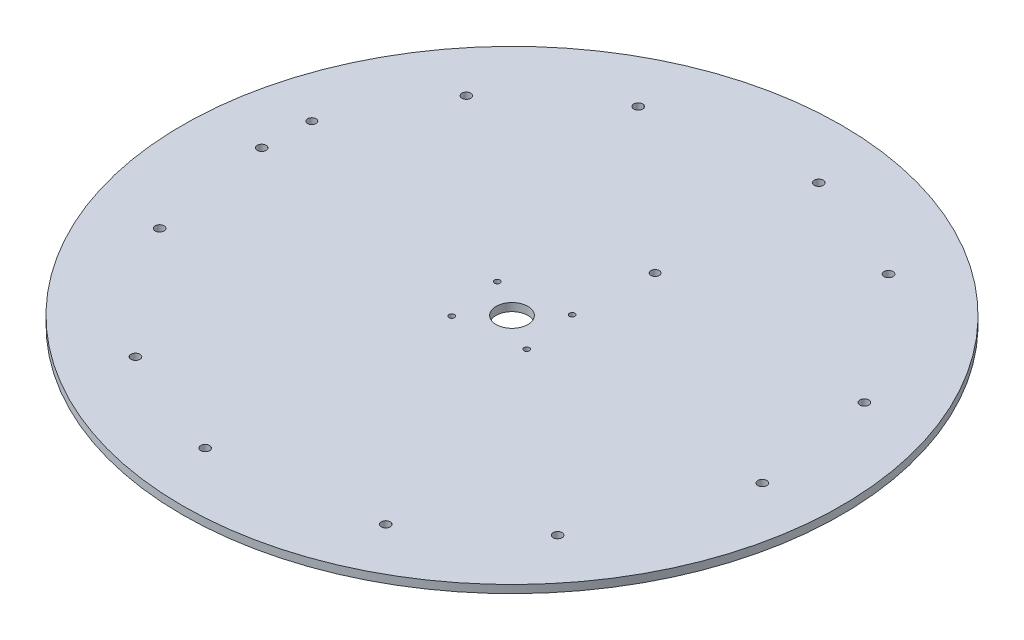
ISO-10303-21;
HEADER;
FILE_DESCRIPTION(('STEP AP214'),'2;1');
FILE_NAME('part.step','',(''),(''),'','','');
FILE_SCHEMA(('AUTOMOTIVE_DESIGN { 1 0 10303 214 1 1 1 1 }'));
ENDSEC;
DATA;
#1=APPLICATION_CONTEXT('core data for automotive mechanical design processes');
#2=APPLICATION_PROTOCOL_DEFINITION('international standard','automotive_design',2000,#1);
#3=PRODUCT_CONTEXT('',#1,'mechanical');
#4=PRODUCT('Part','Part','',(#3));
#5=PRODUCT_RELATED_PRODUCT_CATEGORY('part','',(#4));
#6=PRODUCT_DEFINITION_FORMATION('','',#4);
#7=PRODUCT_DEFINITION_CONTEXT('part definition',#1,'design');
#8=PRODUCT_DEFINITION('design','',#6,#7);
#9=PRODUCT_DEFINITION_SHAPE('','',#8);
#10=(LENGTH_UNIT() NAMED_UNIT(*) SI_UNIT(.MILLI.,.METRE.));
#11=(NAMED_UNIT(*) PLANE_ANGLE_UNIT() SI_UNIT($,.RADIAN.));
#12=(NAMED_UNIT(*) SI_UNIT($,.STERADIAN.) SOLID_ANGLE_UNIT());
#13=UNCERTAINTY_MEASURE_WITH_UNIT(LENGTH_MEASURE(1.E-05),#10,'distance_accuracy_value','');
#14=(GEOMETRIC_REPRESENTATION_CONTEXT(3) GLOBAL_UNCERTAINTY_ASSIGNED_CONTEXT((#13)) GLOBAL_UNIT_ASSIGNED_CONTEXT((#10,
#11,#12)) REPRESENTATION_CONTEXT('',''));
#15=CARTESIAN_POINT('',(0.,0.,0.));
#16=DIRECTION('',(0.,0.,1.));
#17=DIRECTION('',(1.,0.,0.));
#18=AXIS2_PLACEMENT_3D('',#15,#16,#17);
#19=CARTESIAN_POINT('',(0.,3.,0.));
#20=DIRECTION('',(0.,-1.,0.));
#21=DIRECTION('',(0.,0.,-1.));
#22=AXIS2_PLACEMENT_3D('',#19,#20,#21);
#23=CYLINDRICAL_SURFACE('',#22,125.);
#24=CARTESIAN_POINT('',(0.,3.,0.));
#25=DIRECTION('',(0.,1.,0.));
#26=DIRECTION('',(0.,0.,1.));
#27=AXIS2_PLACEMENT_3D('',#24,#25,#26);
#28=CIRCLE('',#27,125.);
#29=CARTESIAN_POINT('',(0.,3.,125.));
#30=VERTEX_POINT('',#29);
#31=EDGE_CURVE('E10',#30,#30,#28,.T.);
#32=ORIENTED_EDGE('',*,*,#31,.F.);
#33=EDGE_LOOP('',(#32));
#34=FACE_BOUND('',#33,.T.);
#35=CARTESIAN_POINT('',(0.,0.,0.));
#36=DIRECTION('',(0.,1.,0.));
#37=DIRECTION('',(0.,0.,1.));
#38=AXIS2_PLACEMENT_3D('',#35,#36,#37);
#39=CIRCLE('',#38,125.);
#40=CARTESIAN_POINT('',(0.,0.,125.));
#41=VERTEX_POINT('',#40);
#42=EDGE_CURVE('E43',#41,#41,#39,.T.);
#43=ORIENTED_EDGE('',*,*,#42,.T.);
#44=EDGE_LOOP('',(#43));
#45=FACE_BOUND('',#44,.T.);
#46=ADVANCED_FACE('F36',(#34,#45),#23,.T.);
#47=CARTESIAN_POINT('',(0.,3.,0.));
#48=DIRECTION('',(0.,1.,0.));
#49=DIRECTION('',(0.,0.,1.));
#50=AXIS2_PLACEMENT_3D('',#47,#48,#49);
#51=PLANE('',#50);
#52=CARTESIAN_POINT('',(-57.8243619755745,3.,84.9944281324211));
#53=DIRECTION('',(0.,1.,0.));
#54=DIRECTION('',(0.,0.,1.));
#55=AXIS2_PLACEMENT_3D('',#52,#53,#54);
#56=CIRCLE('',#55,1.7);
#57=CARTESIAN_POINT('',(-57.8243619755745,3.,86.6944281324211));
#58=VERTEX_POINT('',#57);
#59=EDGE_CURVE('E110',#58,#58,#56,.F.);
#60=ORIENTED_EDGE('',*,*,#59,.T.);
#61=EDGE_LOOP('',(#60));
#62=FACE_BOUND('',#61,.T.);
#63=CARTESIAN_POINT('',(95.4266926180047,3.,-38.2289940677021));
#64=DIRECTION('',(0.,1.,0.));
#65=DIRECTION('',(0.,0.,1.));
#66=AXIS2_PLACEMENT_3D('',#63,#64,#65);
#67=CIRCLE('',#66,1.7);
#68=CARTESIAN_POINT('',(95.4266926180047,3.,-36.5289940677021));
#69=VERTEX_POINT('',#68);
#70=EDGE_CURVE('E98',#69,#69,#67,.F.);
#71=ORIENTED_EDGE('',*,*,#70,.T.);
#72=EDGE_LOOP('',(#71));
#73=FACE_BOUND('',#72,.T.);
#74=CARTESIAN_POINT('',(102.519514930595,3.,7.58015236226344));
#75=DIRECTION('',(0.,1.,0.));
#76=DIRECTION('',(0.,0.,1.));
#77=AXIS2_PLACEMENT_3D('',#74,#75,#76);
#78=CIRCLE('',#77,1.7);
#79=CARTESIAN_POINT('',(102.519514930595,3.,9.28015236226344));
#80=VERTEX_POINT('',#79);
#81=EDGE_CURVE('E95',#80,#80,#78,.F.);
#82=ORIENTED_EDGE('',*,*,#81,.T.);
#83=EDGE_LOOP('',(#82));
#84=FACE_BOUND('',#83,.T.);
#85=CARTESIAN_POINT('',(-80.8206263327573,3.,-63.5274429724696));
#86=DIRECTION('',(0.,1.,0.));
#87=DIRECTION('',(0.,0.,1.));
#88=AXIS2_PLACEMENT_3D('',#85,#86,#87);
#89=CIRCLE('',#88,1.7);
#90=CARTESIAN_POINT('',(-80.8206263327573,3.,-61.8274429724696));
#91=VERTEX_POINT('',#90);
#92=EDGE_CURVE('E92',#91,#91,#89,.F.);
#93=ORIENTED_EDGE('',*,*,#92,.T.);
#94=EDGE_LOOP('',(#93));
#95=FACE_BOUND('',#94,.T.);
#96=CARTESIAN_POINT('',(-14.6060662852482,3.,101.756437040172));
#97=DIRECTION('',(0.,1.,0.));
#98=DIRECTION('',(0.,0.,1.));
#99=AXIS2_PLACEMENT_3D('',#96,#97,#98);
#100=CIRCLE('',#99,1.7);
#101=CARTESIAN_POINT('',(-14.6060662852482,3.,103.456437040172));
#102=VERTEX_POINT('',#101);
#103=EDGE_CURVE('E88',#102,#102,#100,.F.);
#104=ORIENTED_EDGE('',*,*,#103,.T.);
#105=EDGE_LOOP('',(#104));
#106=FACE_BOUND('',#105,.T.);
#107=CARTESIAN_POINT('',(-44.6951529550211,3.,-92.5745804946846));
#108=DIRECTION('',(0.,1.,0.));
#109=DIRECTION('',(0.,0.,1.));
#110=AXIS2_PLACEMENT_3D('',#107,#108,#109);
#111=CIRCLE('',#110,1.7);
#112=CARTESIAN_POINT('',(-44.6951529550211,3.,-90.8745804946846));
#113=VERTEX_POINT('',#112);
#114=EDGE_CURVE('E84',#113,#113,#111,.F.);
#115=ORIENTED_EDGE('',*,*,#114,.T.);
#116=EDGE_LOOP('',(#115));
#117=FACE_BOUND('',#116,.T.);
#118=CARTESIAN_POINT('',(11.1984146036627,3.,-11.6251485565594));
#119=DIRECTION('',(0.,1.,0.));
#120=DIRECTION('',(0.,0.,1.));
#121=AXIS2_PLACEMENT_3D('',#118,#119,#120);
#122=CIRCLE('',#121,1.05);
#123=CARTESIAN_POINT('',(11.1984146036627,3.,-10.5751485565594));
#124=VERTEX_POINT('',#123);
#125=EDGE_CURVE('E114',#124,#124,#122,.T.);
#126=ORIENTED_EDGE('',*,*,#125,.F.);
#127=EDGE_LOOP('',(#126));
#128=FACE_BOUND('',#127,.T.);
#129=CARTESIAN_POINT('',(13.8891587950704,3.,8.30091436381541));
#130=DIRECTION('',(0.,1.,0.));
#131=DIRECTION('',(0.,0.,1.));
#132=AXIS2_PLACEMENT_3D('',#129,#130,#131);
#133=CIRCLE('',#132,1.05);
#134=CARTESIAN_POINT('',(13.8891587950704,3.,9.35091436381541));
#135=VERTEX_POINT('',#134);
#136=EDGE_CURVE('E122',#135,#135,#133,.T.);
#137=ORIENTED_EDGE('',*,*,#136,.F.);
#138=EDGE_LOOP('',(#137));
#139=FACE_BOUND('',#138,.T.);
#140=CARTESIAN_POINT('',(-11.1984146036629,3.,11.6251485565594));
#141=DIRECTION('',(0.,1.,0.));
#142=DIRECTION('',(0.,0.,1.));
#143=AXIS2_PLACEMENT_3D('',#140,#141,#142);
#144=CIRCLE('',#143,1.05);
#145=CARTESIAN_POINT('',(-11.1984146036629,3.,12.6751485565594));
#146=VERTEX_POINT('',#145);
#147=EDGE_CURVE('E128',#146,#146,#144,.T.);
#148=ORIENTED_EDGE('',*,*,#147,.F.);
#149=EDGE_LOOP('',(#148));
#150=FACE_BOUND('',#149,.T.);
#151=CARTESIAN_POINT('',(-13.8891587950706,3.,-8.30091436381542));
#152=DIRECTION('',(0.,1.,0.));
#153=DIRECTION('',(0.,0.,1.));
#154=AXIS2_PLACEMENT_3D('',#151,#152,#153);
#155=CIRCLE('',#154,1.05);
#156=CARTESIAN_POINT('',(-13.8891587950706,3.,-7.25091436381541));
#157=VERTEX_POINT('',#156);
#158=EDGE_CURVE('E113',#157,#157,#155,.T.);
#159=ORIENTED_EDGE('',*,*,#158,.F.);
#160=EDGE_LOOP('',(#159));
#161=FACE_BOUND('',#160,.T.);
#162=CARTESIAN_POINT('',(-101.77809989739,3.,-25.8547554866955));
#163=DIRECTION('',(0.,-1.,0.));
#164=DIRECTION('',(0.,0.,-1.));
#165=AXIS2_PLACEMENT_3D('',#162,#163,#164);
#166=CIRCLE('',#165,1.6);
#167=CARTESIAN_POINT('',(-101.77809989739,3.,-27.4547554866955));
#168=VERTEX_POINT('',#167);
#169=EDGE_CURVE('E80',#168,#168,#166,.T.);
#170=ORIENTED_EDGE('',*,*,#169,.T.);
#171=EDGE_LOOP('',(#170));
#172=FACE_BOUND('',#171,.T.);
#173=CARTESIAN_POINT('',(13.2167740431928,3.,-41.0921754582449));
#174=DIRECTION('',(0.,-1.,0.));
#175=DIRECTION('',(0.,0.,-1.));
#176=AXIS2_PLACEMENT_3D('',#173,#174,#175);
#177=CIRCLE('',#176,1.6);
#178=CARTESIAN_POINT('',(13.2167740431928,3.,-42.6921754582449));
#179=VERTEX_POINT('',#178);
#180=EDGE_CURVE('E143',#179,#179,#177,.T.);
#181=ORIENTED_EDGE('',*,*,#180,.T.);
#182=EDGE_LOOP('',(#181));
#183=FACE_BOUND('',#182,.T.);
#184=CARTESIAN_POINT('',(0.,3.,0.));
#185=DIRECTION('',(0.,1.,0.));
#186=DIRECTION('',(0.,0.,1.));
#187=AXIS2_PLACEMENT_3D('',#184,#185,#186);
#188=CIRCLE('',#187,6.);
#189=CARTESIAN_POINT('',(0.,3.,6.));
#190=VERTEX_POINT('',#189);
#191=EDGE_CURVE('E57',#190,#190,#188,.F.);
#192=ORIENTED_EDGE('',*,*,#191,.T.);
#193=EDGE_LOOP('',(#192));
#194=FACE_BOUND('',#193,.T.);
#195=CARTESIAN_POINT('',(-102.519514930595,3.,-7.58015236226416));
#196=DIRECTION('',(0.,1.,0.));
#197=DIRECTION('',(0.,0.,1.));
#198=AXIS2_PLACEMENT_3D('',#195,#196,#197);
#199=CIRCLE('',#198,1.7);
#200=CARTESIAN_POINT('',(-102.519514930595,3.,-5.88015236226416));
#201=VERTEX_POINT('',#200);
#202=EDGE_CURVE('E48',#201,#201,#199,.F.);
#203=ORIENTED_EDGE('',*,*,#202,.T.);
#204=EDGE_LOOP('',(#203));
#205=FACE_BOUND('',#204,.T.);
#206=CARTESIAN_POINT('',(80.8206263327569,3.,63.5274429724702));
#207=DIRECTION('',(0.,1.,0.));
#208=DIRECTION('',(0.,0.,1.));
#209=AXIS2_PLACEMENT_3D('',#206,#207,#208);
#210=CIRCLE('',#209,1.7);
#211=CARTESIAN_POINT('',(80.8206263327569,3.,65.2274429724702));
#212=VERTEX_POINT('',#211);
#213=EDGE_CURVE('E73',#212,#212,#210,.F.);
#214=ORIENTED_EDGE('',*,*,#213,.T.);
#215=EDGE_LOOP('',(#214));
#216=FACE_BOUND('',#215,.T.);
#217=CARTESIAN_POINT('',(44.6951529550204,3.,92.5745804946849));
#218=DIRECTION('',(0.,1.,0.));
#219=DIRECTION('',(0.,0.,1.));
#220=AXIS2_PLACEMENT_3D('',#217,#218,#219);
#221=CIRCLE('',#220,1.7);
#222=CARTESIAN_POINT('',(44.6951529550204,3.,94.2745804946849));
#223=VERTEX_POINT('',#222);
#224=EDGE_CURVE('E69',#223,#223,#221,.F.);
#225=ORIENTED_EDGE('',*,*,#224,.T.);
#226=EDGE_LOOP('',(#225));
#227=FACE_BOUND('',#226,.T.);
#228=CARTESIAN_POINT('',(14.6060662852475,3.,-101.756437040172));
#229=DIRECTION('',(0.,1.,0.));
#230=DIRECTION('',(0.,0.,1.));
#231=AXIS2_PLACEMENT_3D('',#228,#229,#230);
#232=CIRCLE('',#231,1.7);
#233=CARTESIAN_POINT('',(14.6060662852475,3.,-100.056437040172));
#234=VERTEX_POINT('',#233);
#235=EDGE_CURVE('E65',#234,#234,#232,.F.);
#236=ORIENTED_EDGE('',*,*,#235,.T.);
#237=EDGE_LOOP('',(#236));
#238=FACE_BOUND('',#237,.T.);
#239=CARTESIAN_POINT('',(-95.426692618005,3.,38.2289940677014));
#240=DIRECTION('',(0.,1.,0.));
#241=DIRECTION('',(0.,0.,1.));
#242=AXIS2_PLACEMENT_3D('',#239,#240,#241);
#243=CIRCLE('',#242,1.7);
#244=CARTESIAN_POINT('',(-95.426692618005,3.,39.9289940677014));
#245=VERTEX_POINT('',#244);
#246=EDGE_CURVE('E61',#245,#245,#243,.F.);
#247=ORIENTED_EDGE('',*,*,#246,.T.);
#248=EDGE_LOOP('',(#247));
#249=FACE_BOUND('',#248,.T.);
#250=CARTESIAN_POINT('',(57.8243619755739,3.,-84.9944281324215));
#251=DIRECTION('',(0.,1.,0.));
#252=DIRECTION('',(0.,0.,1.));
#253=AXIS2_PLACEMENT_3D('',#250,#251,#252);
#254=CIRCLE('',#253,1.7);
#255=CARTESIAN_POINT('',(57.8243619755739,3.,-83.2944281324215));
#256=VERTEX_POINT('',#255);
#257=EDGE_CURVE('E56',#256,#256,#254,.F.);
#258=ORIENTED_EDGE('',*,*,#257,.T.);
#259=EDGE_LOOP('',(#258));
#260=FACE_BOUND('',#259,.T.);
#261=ORIENTED_EDGE('',*,*,#31,.T.);
#262=EDGE_LOOP('',(#261));
#263=FACE_BOUND('',#262,.T.);
#264=ADVANCED_FACE('F160',(#62,#73,#84,#95,#106,#117,#128,#139,#150,#161,#172,#183,#194,#205,
#216,#227,#238,#249,#260,#263),#51,.T.);
#265=CARTESIAN_POINT('',(0.,0.,0.));
#266=DIRECTION('',(0.,1.,0.));
#267=DIRECTION('',(0.,0.,1.));
#268=AXIS2_PLACEMENT_3D('',#265,#266,#267);
#269=PLANE('',#268);
#270=CARTESIAN_POINT('',(-57.8243619755745,0.,84.9944281324211));
#271=DIRECTION('',(0.,1.,0.));
#272=DIRECTION('',(0.,0.,1.));
#273=AXIS2_PLACEMENT_3D('',#270,#271,#272);
#274=CIRCLE('',#273,1.7);
#275=CARTESIAN_POINT('',(-57.8243619755745,0.,86.6944281324211));
#276=VERTEX_POINT('',#275);
#277=EDGE_CURVE('E39',#276,#276,#274,.F.);
#278=ORIENTED_EDGE('',*,*,#277,.F.);
#279=EDGE_LOOP('',(#278));
#280=FACE_BOUND('',#279,.T.);
#281=CARTESIAN_POINT('',(95.4266926180047,0.,-38.2289940677021));
#282=DIRECTION('',(0.,1.,0.));
#283=DIRECTION('',(0.,0.,1.));
#284=AXIS2_PLACEMENT_3D('',#281,#282,#283);
#285=CIRCLE('',#284,1.7);
#286=CARTESIAN_POINT('',(95.4266926180047,0.,-36.5289940677021));
#287=VERTEX_POINT('',#286);
#288=EDGE_CURVE('E96',#287,#287,#285,.F.);
#289=ORIENTED_EDGE('',*,*,#288,.F.);
#290=EDGE_LOOP('',(#289));
#291=FACE_BOUND('',#290,.T.);
#292=CARTESIAN_POINT('',(102.519514930595,0.,7.58015236226344));
#293=DIRECTION('',(0.,1.,0.));
#294=DIRECTION('',(0.,0.,1.));
#295=AXIS2_PLACEMENT_3D('',#292,#293,#294);
#296=CIRCLE('',#295,1.7);
#297=CARTESIAN_POINT('',(102.519514930595,0.,9.28015236226344));
#298=VERTEX_POINT('',#297);
#299=EDGE_CURVE('E93',#298,#298,#296,.F.);
#300=ORIENTED_EDGE('',*,*,#299,.F.);
#301=EDGE_LOOP('',(#300));
#302=FACE_BOUND('',#301,.T.);
#303=CARTESIAN_POINT('',(-80.8206263327573,0.,-63.5274429724696));
#304=DIRECTION('',(0.,1.,0.));
#305=DIRECTION('',(0.,0.,1.));
#306=AXIS2_PLACEMENT_3D('',#303,#304,#305);
#307=CIRCLE('',#306,1.7);
#308=CARTESIAN_POINT('',(-80.8206263327573,0.,-61.8274429724696));
#309=VERTEX_POINT('',#308);
#310=EDGE_CURVE('E89',#309,#309,#307,.F.);
#311=ORIENTED_EDGE('',*,*,#310,.F.);
#312=EDGE_LOOP('',(#311));
#313=FACE_BOUND('',#312,.T.);
#314=CARTESIAN_POINT('',(-14.6060662852482,0.,101.756437040172));
#315=DIRECTION('',(0.,1.,0.));
#316=DIRECTION('',(0.,0.,1.));
#317=AXIS2_PLACEMENT_3D('',#314,#315,#316);
#318=CIRCLE('',#317,1.7);
#319=CARTESIAN_POINT('',(-14.6060662852482,0.,103.456437040172));
#320=VERTEX_POINT('',#319);
#321=EDGE_CURVE('E85',#320,#320,#318,.F.);
#322=ORIENTED_EDGE('',*,*,#321,.F.);
#323=EDGE_LOOP('',(#322));
#324=FACE_BOUND('',#323,.T.);
#325=CARTESIAN_POINT('',(-44.6951529550211,0.,-92.5745804946846));
#326=DIRECTION('',(0.,1.,0.));
#327=DIRECTION('',(0.,0.,1.));
#328=AXIS2_PLACEMENT_3D('',#325,#326,#327);
#329=CIRCLE('',#328,1.7);
#330=CARTESIAN_POINT('',(-44.6951529550211,0.,-90.8745804946846));
#331=VERTEX_POINT('',#330);
#332=EDGE_CURVE('E81',#331,#331,#329,.F.);
#333=ORIENTED_EDGE('',*,*,#332,.F.);
#334=EDGE_LOOP('',(#333));
#335=FACE_BOUND('',#334,.T.);
#336=CARTESIAN_POINT('',(11.1984146036627,0.,-11.6251485565594));
#337=DIRECTION('',(0.,1.,0.));
#338=DIRECTION('',(0.,0.,1.));
#339=AXIS2_PLACEMENT_3D('',#336,#337,#338);
#340=CIRCLE('',#339,1.05);
#341=CARTESIAN_POINT('',(11.1984146036627,0.,-10.5751485565594));
#342=VERTEX_POINT('',#341);
#343=EDGE_CURVE('E117',#342,#342,#340,.F.);
#344=ORIENTED_EDGE('',*,*,#343,.F.);
#345=EDGE_LOOP('',(#344));
#346=FACE_BOUND('',#345,.T.);
#347=CARTESIAN_POINT('',(13.8891587950704,0.,8.30091436381541));
#348=DIRECTION('',(0.,1.,0.));
#349=DIRECTION('',(0.,0.,1.));
#350=AXIS2_PLACEMENT_3D('',#347,#348,#349);
#351=CIRCLE('',#350,1.05);
#352=CARTESIAN_POINT('',(13.8891587950704,0.,9.35091436381541));
#353=VERTEX_POINT('',#352);
#354=EDGE_CURVE('E118',#353,#353,#351,.F.);
#355=ORIENTED_EDGE('',*,*,#354,.F.);
#356=EDGE_LOOP('',(#355));
#357=FACE_BOUND('',#356,.T.);
#358=CARTESIAN_POINT('',(-11.1984146036629,0.,11.6251485565594));
#359=DIRECTION('',(0.,1.,0.));
#360=DIRECTION('',(0.,0.,1.));
#361=AXIS2_PLACEMENT_3D('',#358,#359,#360);
#362=CIRCLE('',#361,1.05);
#363=CARTESIAN_POINT('',(-11.1984146036629,0.,12.6751485565594));
#364=VERTEX_POINT('',#363);
#365=EDGE_CURVE('E125',#364,#364,#362,.F.);
#366=ORIENTED_EDGE('',*,*,#365,.F.);
#367=EDGE_LOOP('',(#366));
#368=FACE_BOUND('',#367,.T.);
#369=CARTESIAN_POINT('',(-13.8891587950706,0.,-8.30091436381542));
#370=DIRECTION('',(0.,1.,0.));
#371=DIRECTION('',(0.,0.,1.));
#372=AXIS2_PLACEMENT_3D('',#369,#370,#371);
#373=CIRCLE('',#372,1.05);
#374=CARTESIAN_POINT('',(-13.8891587950706,0.,-7.25091436381541));
#375=VERTEX_POINT('',#374);
#376=EDGE_CURVE('E131',#375,#375,#373,.F.);
#377=ORIENTED_EDGE('',*,*,#376,.F.);
#378=EDGE_LOOP('',(#377));
#379=FACE_BOUND('',#378,.T.);
#380=CARTESIAN_POINT('',(-101.77809989739,0.,-25.8547554866955));
#381=DIRECTION('',(0.,-1.,0.));
#382=DIRECTION('',(0.,0.,-1.));
#383=AXIS2_PLACEMENT_3D('',#380,#381,#382);
#384=CIRCLE('',#383,1.6);
#385=CARTESIAN_POINT('',(-101.77809989739,0.,-27.4547554866955));
#386=VERTEX_POINT('',#385);
#387=EDGE_CURVE('E140',#386,#386,#384,.T.);
#388=ORIENTED_EDGE('',*,*,#387,.F.);
#389=EDGE_LOOP('',(#388));
#390=FACE_BOUND('',#389,.T.);
#391=CARTESIAN_POINT('',(13.2167740431928,0.,-41.0921754582449));
#392=DIRECTION('',(0.,-1.,0.));
#393=DIRECTION('',(0.,0.,-1.));
#394=AXIS2_PLACEMENT_3D('',#391,#392,#393);
#395=CIRCLE('',#394,1.6);
#396=CARTESIAN_POINT('',(13.2167740431928,0.,-42.6921754582449));
#397=VERTEX_POINT('',#396);
#398=EDGE_CURVE('E121',#397,#397,#395,.T.);
#399=ORIENTED_EDGE('',*,*,#398,.F.);
#400=EDGE_LOOP('',(#399));
#401=FACE_BOUND('',#400,.T.);
#402=CARTESIAN_POINT('',(0.,0.,0.));
#403=DIRECTION('',(0.,1.,0.));
#404=DIRECTION('',(0.,0.,1.));
#405=AXIS2_PLACEMENT_3D('',#402,#403,#404);
#406=CIRCLE('',#405,6.);
#407=CARTESIAN_POINT('',(0.,0.,6.));
#408=VERTEX_POINT('',#407);
#409=EDGE_CURVE('E77',#408,#408,#406,.F.);
#410=ORIENTED_EDGE('',*,*,#409,.F.);
#411=EDGE_LOOP('',(#410));
#412=FACE_BOUND('',#411,.T.);
#413=CARTESIAN_POINT('',(-102.519514930595,0.,-7.58015236226416));
#414=DIRECTION('',(0.,1.,0.));
#415=DIRECTION('',(0.,0.,1.));
#416=AXIS2_PLACEMENT_3D('',#413,#414,#415);
#417=CIRCLE('',#416,1.7);
#418=CARTESIAN_POINT('',(-102.519514930595,0.,-5.88015236226416));
#419=VERTEX_POINT('',#418);
#420=EDGE_CURVE('E74',#419,#419,#417,.F.);
#421=ORIENTED_EDGE('',*,*,#420,.F.);
#422=EDGE_LOOP('',(#421));
#423=FACE_BOUND('',#422,.T.);
#424=CARTESIAN_POINT('',(80.8206263327569,0.,63.5274429724702));
#425=DIRECTION('',(0.,1.,0.));
#426=DIRECTION('',(0.,0.,1.));
#427=AXIS2_PLACEMENT_3D('',#424,#425,#426);
#428=CIRCLE('',#427,1.7);
#429=CARTESIAN_POINT('',(80.8206263327569,0.,65.2274429724702));
#430=VERTEX_POINT('',#429);
#431=EDGE_CURVE('E70',#430,#430,#428,.F.);
#432=ORIENTED_EDGE('',*,*,#431,.F.);
#433=EDGE_LOOP('',(#432));
#434=FACE_BOUND('',#433,.T.);
#435=CARTESIAN_POINT('',(44.6951529550204,0.,92.5745804946849));
#436=DIRECTION('',(0.,1.,0.));
#437=DIRECTION('',(0.,0.,1.));
#438=AXIS2_PLACEMENT_3D('',#435,#436,#437);
#439=CIRCLE('',#438,1.7);
#440=CARTESIAN_POINT('',(44.6951529550204,0.,94.2745804946849));
#441=VERTEX_POINT('',#440);
#442=EDGE_CURVE('E66',#441,#441,#439,.F.);
#443=ORIENTED_EDGE('',*,*,#442,.F.);
#444=EDGE_LOOP('',(#443));
#445=FACE_BOUND('',#444,.T.);
#446=CARTESIAN_POINT('',(14.6060662852475,0.,-101.756437040172));
#447=DIRECTION('',(0.,1.,0.));
#448=DIRECTION('',(0.,0.,1.));
#449=AXIS2_PLACEMENT_3D('',#446,#447,#448);
#450=CIRCLE('',#449,1.7);
#451=CARTESIAN_POINT('',(14.6060662852475,0.,-100.056437040172));
#452=VERTEX_POINT('',#451);
#453=EDGE_CURVE('E62',#452,#452,#450,.F.);
#454=ORIENTED_EDGE('',*,*,#453,.F.);
#455=EDGE_LOOP('',(#454));
#456=FACE_BOUND('',#455,.T.);
#457=CARTESIAN_POINT('',(-95.426692618005,0.,38.2289940677014));
#458=DIRECTION('',(0.,1.,0.));
#459=DIRECTION('',(0.,0.,1.));
#460=AXIS2_PLACEMENT_3D('',#457,#458,#459);
#461=CIRCLE('',#460,1.7);
#462=CARTESIAN_POINT('',(-95.426692618005,0.,39.9289940677014));
#463=VERTEX_POINT('',#462);
#464=EDGE_CURVE('E58',#463,#463,#461,.F.);
#465=ORIENTED_EDGE('',*,*,#464,.F.);
#466=EDGE_LOOP('',(#465));
#467=FACE_BOUND('',#466,.T.);
#468=CARTESIAN_POINT('',(57.8243619755739,0.,-84.9944281324215));
#469=DIRECTION('',(0.,1.,0.));
#470=DIRECTION('',(0.,0.,1.));
#471=AXIS2_PLACEMENT_3D('',#468,#469,#470);
#472=CIRCLE('',#471,1.7);
#473=CARTESIAN_POINT('',(57.8243619755739,0.,-83.2944281324215));
#474=VERTEX_POINT('',#473);
#475=EDGE_CURVE('E53',#474,#474,#472,.F.);
#476=ORIENTED_EDGE('',*,*,#475,.F.);
#477=EDGE_LOOP('',(#476));
#478=FACE_BOUND('',#477,.T.);
#479=ORIENTED_EDGE('',*,*,#42,.F.);
#480=EDGE_LOOP('',(#479));
#481=FACE_BOUND('',#480,.T.);
#482=ADVANCED_FACE('F171',(#280,#291,#302,#313,#324,#335,#346,#357,#368,#379,#390,#401,#412,
#423,#434,#445,#456,#467,#478,#481),#269,.F.);
#483=CARTESIAN_POINT('',(57.8243619755739,65.,-84.9944281324215));
#484=DIRECTION('',(0.,-1.,0.));
#485=DIRECTION('',(0.,0.,-1.));
#486=AXIS2_PLACEMENT_3D('',#483,#484,#485);
#487=CYLINDRICAL_SURFACE('',#486,1.7);
#488=ORIENTED_EDGE('',*,*,#257,.F.);
#489=EDGE_LOOP('',(#488));
#490=FACE_BOUND('',#489,.T.);
#491=ORIENTED_EDGE('',*,*,#475,.T.);
#492=EDGE_LOOP('',(#491));
#493=FACE_BOUND('',#492,.T.);
#494=ADVANCED_FACE('F174',(#490,#493),#487,.F.);
#495=CARTESIAN_POINT('',(-95.426692618005,65.,38.2289940677014));
#496=DIRECTION('',(0.,-1.,0.));
#497=DIRECTION('',(0.,0.,-1.));
#498=AXIS2_PLACEMENT_3D('',#495,#496,#497);
#499=CYLINDRICAL_SURFACE('',#498,1.7);
#500=ORIENTED_EDGE('',*,*,#246,.F.);
#501=EDGE_LOOP('',(#500));
#502=FACE_BOUND('',#501,.T.);
#503=ORIENTED_EDGE('',*,*,#464,.T.);
#504=EDGE_LOOP('',(#503));
#505=FACE_BOUND('',#504,.T.);
#506=ADVANCED_FACE('F199',(#502,#505),#499,.F.);
#507=CARTESIAN_POINT('',(14.6060662852475,65.,-101.756437040172));
#508=DIRECTION('',(0.,-1.,0.));
#509=DIRECTION('',(0.,0.,-1.));
#510=AXIS2_PLACEMENT_3D('',#507,#508,#509);
#511=CYLINDRICAL_SURFACE('',#510,1.7);
#512=ORIENTED_EDGE('',*,*,#235,.F.);
#513=EDGE_LOOP('',(#512));
#514=FACE_BOUND('',#513,.T.);
#515=ORIENTED_EDGE('',*,*,#453,.T.);
#516=EDGE_LOOP('',(#515));
#517=FACE_BOUND('',#516,.T.);
#518=ADVANCED_FACE('F203',(#514,#517),#511,.F.);
#519=CARTESIAN_POINT('',(44.6951529550204,65.,92.5745804946849));
#520=DIRECTION('',(0.,-1.,0.));
#521=DIRECTION('',(0.,0.,-1.));
#522=AXIS2_PLACEMENT_3D('',#519,#520,#521);
#523=CYLINDRICAL_SURFACE('',#522,1.7);
#524=ORIENTED_EDGE('',*,*,#224,.F.);
#525=EDGE_LOOP('',(#524));
#526=FACE_BOUND('',#525,.T.);
#527=ORIENTED_EDGE('',*,*,#442,.T.);
#528=EDGE_LOOP('',(#527));
#529=FACE_BOUND('',#528,.T.);
#530=ADVANCED_FACE('F167',(#526,#529),#523,.F.);
#531=CARTESIAN_POINT('',(80.8206263327569,65.,63.5274429724702));
#532=DIRECTION('',(0.,-1.,0.));
#533=DIRECTION('',(0.,0.,-1.));
#534=AXIS2_PLACEMENT_3D('',#531,#532,#533);
#535=CYLINDRICAL_SURFACE('',#534,1.7);
#536=ORIENTED_EDGE('',*,*,#213,.F.);
#537=EDGE_LOOP('',(#536));
#538=FACE_BOUND('',#537,.T.);
#539=ORIENTED_EDGE('',*,*,#431,.T.);
#540=EDGE_LOOP('',(#539));
#541=FACE_BOUND('',#540,.T.);
#542=ADVANCED_FACE('F163',(#538,#541),#535,.F.);
#543=CARTESIAN_POINT('',(-102.519514930595,65.,-7.58015236226416));
#544=DIRECTION('',(0.,-1.,0.));
#545=DIRECTION('',(0.,0.,-1.));
#546=AXIS2_PLACEMENT_3D('',#543,#544,#545);
#547=CYLINDRICAL_SURFACE('',#546,1.7);
#548=ORIENTED_EDGE('',*,*,#202,.F.);
#549=EDGE_LOOP('',(#548));
#550=FACE_BOUND('',#549,.T.);
#551=ORIENTED_EDGE('',*,*,#420,.T.);
#552=EDGE_LOOP('',(#551));
#553=FACE_BOUND('',#552,.T.);
#554=ADVANCED_FACE('F166',(#550,#553),#547,.F.);
#555=CARTESIAN_POINT('',(0.,58.,0.));
#556=DIRECTION('',(0.,-1.,0.));
#557=DIRECTION('',(0.,0.,-1.));
#558=AXIS2_PLACEMENT_3D('',#555,#556,#557);
#559=CYLINDRICAL_SURFACE('',#558,6.);
#560=ORIENTED_EDGE('',*,*,#191,.F.);
#561=EDGE_LOOP('',(#560));
#562=FACE_BOUND('',#561,.T.);
#563=ORIENTED_EDGE('',*,*,#409,.T.);
#564=EDGE_LOOP('',(#563));
#565=FACE_BOUND('',#564,.T.);
#566=ADVANCED_FACE('F209',(#562,#565),#559,.F.);
#567=CARTESIAN_POINT('',(13.2167740431928,3.,-41.0921754582449));
#568=DIRECTION('',(0.,-1.,0.));
#569=DIRECTION('',(0.,0.,-1.));
#570=AXIS2_PLACEMENT_3D('',#567,#568,#569);
#571=CYLINDRICAL_SURFACE('',#570,1.6);
#572=ORIENTED_EDGE('',*,*,#180,.F.);
#573=EDGE_LOOP('',(#572));
#574=FACE_BOUND('',#573,.T.);
#575=ORIENTED_EDGE('',*,*,#398,.T.);
#576=EDGE_LOOP('',(#575));
#577=FACE_BOUND('',#576,.T.);
#578=ADVANCED_FACE('F217',(#574,#577),#571,.F.);
#579=CARTESIAN_POINT('',(-101.77809989739,3.,-25.8547554866955));
#580=DIRECTION('',(0.,-1.,0.));
#581=DIRECTION('',(0.,0.,-1.));
#582=AXIS2_PLACEMENT_3D('',#579,#580,#581);
#583=CYLINDRICAL_SURFACE('',#582,1.6);
#584=ORIENTED_EDGE('',*,*,#169,.F.);
#585=EDGE_LOOP('',(#584));
#586=FACE_BOUND('',#585,.T.);
#587=ORIENTED_EDGE('',*,*,#387,.T.);
#588=EDGE_LOOP('',(#587));
#589=FACE_BOUND('',#588,.T.);
#590=ADVANCED_FACE('F221',(#586,#589),#583,.F.);
#591=CARTESIAN_POINT('',(-13.8891587950706,-0.00100000000000013,-8.30091436381542));
#592=DIRECTION('',(0.,1.,0.));
#593=DIRECTION('',(0.,0.,1.));
#594=AXIS2_PLACEMENT_3D('',#591,#592,#593);
#595=CYLINDRICAL_SURFACE('',#594,1.05);
#596=CARTESIAN_POINT('',(-13.8891587950706,3.,-7.25091436381541));
#597=CARTESIAN_POINT('',(-13.8891587950706,2.96875,-7.25091436381541));
#598=CARTESIAN_POINT('',(-13.8891587950706,2.9375,-7.25091436381541));
#599=CARTESIAN_POINT('',(-13.8891587950706,2.875,-7.25091436381541));
#600=CARTESIAN_POINT('',(-13.8891587950706,2.84375,-7.25091436381541));
#601=CARTESIAN_POINT('',(-13.8891587950706,2.78125,-7.25091436381541));
#602=CARTESIAN_POINT('',(-13.8891587950706,2.75,-7.25091436381541));
#603=CARTESIAN_POINT('',(-13.8891587950706,2.6875,-7.25091436381541));
#604=CARTESIAN_POINT('',(-13.8891587950706,2.65625,-7.25091436381541));
#605=CARTESIAN_POINT('',(-13.8891587950706,2.59375,-7.25091436381541));
#606=CARTESIAN_POINT('',(-13.8891587950706,2.5625,-7.25091436381541));
#607=CARTESIAN_POINT('',(-13.8891587950706,2.5,-7.25091436381541));
#608=CARTESIAN_POINT('',(-13.8891587950706,2.46875,-7.25091436381541));
#609=CARTESIAN_POINT('',(-13.8891587950706,2.40625,-7.25091436381541));
#610=CARTESIAN_POINT('',(-13.8891587950706,2.375,-7.25091436381541));
#611=CARTESIAN_POINT('',(-13.8891587950706,2.3125,-7.25091436381541));
#612=CARTESIAN_POINT('',(-13.8891587950706,2.28125,-7.25091436381541));
#613=CARTESIAN_POINT('',(-13.8891587950706,2.21875,-7.25091436381541));
#614=CARTESIAN_POINT('',(-13.8891587950706,2.1875,-7.25091436381541));
#615=CARTESIAN_POINT('',(-13.8891587950706,2.125,-7.25091436381541));
#616=CARTESIAN_POINT('',(-13.8891587950706,2.09375,-7.25091436381541));
#617=CARTESIAN_POINT('',(-13.8891587950706,2.03125,-7.25091436381541));
#618=CARTESIAN_POINT('',(-13.8891587950706,2.,-7.25091436381541));
#619=CARTESIAN_POINT('',(-13.8891587950706,1.9375,-7.25091436381541));
#620=CARTESIAN_POINT('',(-13.8891587950706,1.90625,-7.25091436381541));
#621=CARTESIAN_POINT('',(-13.8891587950706,1.84375,-7.25091436381541));
#622=CARTESIAN_POINT('',(-13.8891587950706,1.8125,-7.25091436381541));
#623=CARTESIAN_POINT('',(-13.8891587950706,1.75,-7.25091436381541));
#624=CARTESIAN_POINT('',(-13.8891587950706,1.71875,-7.25091436381541));
#625=CARTESIAN_POINT('',(-13.8891587950706,1.65625,-7.25091436381541));
#626=CARTESIAN_POINT('',(-13.8891587950706,1.625,-7.25091436381541));
#627=CARTESIAN_POINT('',(-13.8891587950706,1.5625,-7.25091436381541));
#628=CARTESIAN_POINT('',(-13.8891587950706,1.53125,-7.25091436381541));
#629=CARTESIAN_POINT('',(-13.8891587950706,1.46875,-7.25091436381541));
#630=CARTESIAN_POINT('',(-13.8891587950706,1.4375,-7.25091436381541));
#631=CARTESIAN_POINT('',(-13.8891587950706,1.375,-7.25091436381541));
#632=CARTESIAN_POINT('',(-13.8891587950706,1.34375,-7.25091436381541));
#633=CARTESIAN_POINT('',(-13.8891587950706,1.28125,-7.25091436381541));
#634=CARTESIAN_POINT('',(-13.8891587950706,1.25,-7.25091436381541));
#635=CARTESIAN_POINT('',(-13.8891587950706,1.1875,-7.25091436381541));
#636=CARTESIAN_POINT('',(-13.8891587950706,1.15625,-7.25091436381541));
#637=CARTESIAN_POINT('',(-13.8891587950706,1.09375,-7.25091436381541));
#638=CARTESIAN_POINT('',(-13.8891587950706,1.0625,-7.25091436381541));
#639=CARTESIAN_POINT('',(-13.8891587950706,1.,-7.25091436381541));
#640=CARTESIAN_POINT('',(-13.8891587950706,0.96875,-7.25091436381541));
#641=CARTESIAN_POINT('',(-13.8891587950706,0.90625,-7.25091436381541));
#642=CARTESIAN_POINT('',(-13.8891587950706,0.875,-7.25091436381541));
#643=CARTESIAN_POINT('',(-13.8891587950706,0.8125,-7.25091436381541));
#644=CARTESIAN_POINT('',(-13.8891587950706,0.78125,-7.25091436381541));
#645=CARTESIAN_POINT('',(-13.8891587950706,0.71875,-7.25091436381541));
#646=CARTESIAN_POINT('',(-13.8891587950706,0.6875,-7.25091436381541));
#647=CARTESIAN_POINT('',(-13.8891587950706,0.625,-7.25091436381541));
#648=CARTESIAN_POINT('',(-13.8891587950706,0.59375,-7.25091436381541));
#649=CARTESIAN_POINT('',(-13.8891587950706,0.53125,-7.25091436381541));
#650=CARTESIAN_POINT('',(-13.8891587950706,0.5,-7.25091436381541));
#651=CARTESIAN_POINT('',(-13.8891587950706,0.4375,-7.25091436381541));
#652=CARTESIAN_POINT('',(-13.8891587950706,0.40625,-7.25091436381541));
#653=CARTESIAN_POINT('',(-13.8891587950706,0.34375,-7.25091436381541));
#654=CARTESIAN_POINT('',(-13.8891587950706,0.3125,-7.25091436381541));
#655=CARTESIAN_POINT('',(-13.8891587950706,0.25,-7.25091436381541));
#656=CARTESIAN_POINT('',(-13.8891587950706,0.21875,-7.25091436381541));
#657=CARTESIAN_POINT('',(-13.8891587950706,0.15625,-7.25091436381541));
#658=CARTESIAN_POINT('',(-13.8891587950706,0.125,-7.25091436381541));
#659=CARTESIAN_POINT('',(-13.8891587950706,0.0625000000000001,-7.25091436381541));
#660=CARTESIAN_POINT('',(-13.8891587950706,0.0312500000000001,-7.25091436381541));
#661=CARTESIAN_POINT('',(-13.8891587950706,0.,-7.25091436381541));
#662=B_SPLINE_CURVE_WITH_KNOTS('',3,(#596,#597,#598,#599,#600,#601,#602,#603,#604,#605,#606,
#607,#608,#609,#610,#611,#612,#613,#614,#615,#616,#617,#618,#619,#620,#621,#622,#623,#624,#625,
#626,#627,#628,#629,#630,#631,#632,#633,#634,#635,#636,#637,#638,#639,#640,#641,#642,#643,#644,
#645,#646,#647,#648,#649,#650,#651,#652,#653,#654,#655,#656,#657,#658,#659,#660,#661),
.UNSPECIFIED.,.F.,.F.,(4,2,2,2,2,2,2,2,2,2,2,2,2,2,2,2,2,2,2,2,2,2,2,2,2,2,2,2,2,2,2,2,4),(0.,
0.0937500000000001,0.1875,0.28125,0.375,0.46875,0.5625,0.65625,0.75,0.84375,0.9375,1.03125,
1.125,1.21875,1.3125,1.40625,1.5,1.59375,1.6875,1.78125,1.875,1.96875,2.0625,2.15625,2.25,
2.34375,2.4375,2.53125,2.625,2.71875,2.8125,2.90625,3.),.UNSPECIFIED.);
#663=EDGE_CURVE('BSEAM225',#157,#375,#662,.T.);
#664=ORIENTED_EDGE('',*,*,#158,.T.);
#665=ORIENTED_EDGE('',*,*,#376,.T.);
#666=ORIENTED_EDGE('',*,*,#663,.T.);
#667=ORIENTED_EDGE('',*,*,#663,.F.);
#668=EDGE_LOOP('',(#664,#666,#665,#667));
#669=FACE_BOUND('',#668,.T.);
#670=ADVANCED_FACE('F225',(#669),#595,.F.);
#671=CARTESIAN_POINT('',(-11.1984146036629,-0.00100000000000013,11.6251485565594));
#672=DIRECTION('',(0.,1.,0.));
#673=DIRECTION('',(0.,0.,1.));
#674=AXIS2_PLACEMENT_3D('',#671,#672,#673);
#675=CYLINDRICAL_SURFACE('',#674,1.05);
#676=CARTESIAN_POINT('',(-11.1984146036629,3.,12.6751485565594));
#677=CARTESIAN_POINT('',(-11.1984146036629,2.96875,12.6751485565594));
#678=CARTESIAN_POINT('',(-11.1984146036629,2.9375,12.6751485565594));
#679=CARTESIAN_POINT('',(-11.1984146036629,2.875,12.6751485565594));
#680=CARTESIAN_POINT('',(-11.1984146036629,2.84375,12.6751485565594));
#681=CARTESIAN_POINT('',(-11.1984146036629,2.78125,12.6751485565594));
#682=CARTESIAN_POINT('',(-11.1984146036629,2.75,12.6751485565594));
#683=CARTESIAN_POINT('',(-11.1984146036629,2.6875,12.6751485565594));
#684=CARTESIAN_POINT('',(-11.1984146036629,2.65625,12.6751485565594));
#685=CARTESIAN_POINT('',(-11.1984146036629,2.59375,12.6751485565594));
#686=CARTESIAN_POINT('',(-11.1984146036629,2.5625,12.6751485565594));
#687=CARTESIAN_POINT('',(-11.1984146036629,2.5,12.6751485565594));
#688=CARTESIAN_POINT('',(-11.1984146036629,2.46875,12.6751485565594));
#689=CARTESIAN_POINT('',(-11.1984146036629,2.40625,12.6751485565594));
#690=CARTESIAN_POINT('',(-11.1984146036629,2.375,12.6751485565594));
#691=CARTESIAN_POINT('',(-11.1984146036629,2.3125,12.6751485565594));
#692=CARTESIAN_POINT('',(-11.1984146036629,2.28125,12.6751485565594));
#693=CARTESIAN_POINT('',(-11.1984146036629,2.21875,12.6751485565594));
#694=CARTESIAN_POINT('',(-11.1984146036629,2.1875,12.6751485565594));
#695=CARTESIAN_POINT('',(-11.1984146036629,2.125,12.6751485565594));
#696=CARTESIAN_POINT('',(-11.1984146036629,2.09375,12.6751485565594));
#697=CARTESIAN_POINT('',(-11.1984146036629,2.03125,12.6751485565594));
#698=CARTESIAN_POINT('',(-11.1984146036629,2.,12.6751485565594));
#699=CARTESIAN_POINT('',(-11.1984146036629,1.9375,12.6751485565594));
#700=CARTESIAN_POINT('',(-11.1984146036629,1.90625,12.6751485565594));
#701=CARTESIAN_POINT('',(-11.1984146036629,1.84375,12.6751485565594));
#702=CARTESIAN_POINT('',(-11.1984146036629,1.8125,12.6751485565594));
#703=CARTESIAN_POINT('',(-11.1984146036629,1.75,12.6751485565594));
#704=CARTESIAN_POINT('',(-11.1984146036629,1.71875,12.6751485565594));
#705=CARTESIAN_POINT('',(-11.1984146036629,1.65625,12.6751485565594));
#706=CARTESIAN_POINT('',(-11.1984146036629,1.625,12.6751485565594));
#707=CARTESIAN_POINT('',(-11.1984146036629,1.5625,12.6751485565594));
#708=CARTESIAN_POINT('',(-11.1984146036629,1.53125,12.6751485565594));
#709=CARTESIAN_POINT('',(-11.1984146036629,1.46875,12.6751485565594));
#710=CARTESIAN_POINT('',(-11.1984146036629,1.4375,12.6751485565594));
#711=CARTESIAN_POINT('',(-11.1984146036629,1.375,12.6751485565594));
#712=CARTESIAN_POINT('',(-11.1984146036629,1.34375,12.6751485565594));
#713=CARTESIAN_POINT('',(-11.1984146036629,1.28125,12.6751485565594));
#714=CARTESIAN_POINT('',(-11.1984146036629,1.25,12.6751485565594));
#715=CARTESIAN_POINT('',(-11.1984146036629,1.1875,12.6751485565594));
#716=CARTESIAN_POINT('',(-11.1984146036629,1.15625,12.6751485565594));
#717=CARTESIAN_POINT('',(-11.1984146036629,1.09375,12.6751485565594));
#718=CARTESIAN_POINT('',(-11.1984146036629,1.0625,12.6751485565594));
#719=CARTESIAN_POINT('',(-11.1984146036629,1.,12.6751485565594));
#720=CARTESIAN_POINT('',(-11.1984146036629,0.96875,12.6751485565594));
#721=CARTESIAN_POINT('',(-11.1984146036629,0.90625,12.6751485565594));
#722=CARTESIAN_POINT('',(-11.1984146036629,0.875,12.6751485565594));
#723=CARTESIAN_POINT('',(-11.1984146036629,0.8125,12.6751485565594));
#724=CARTESIAN_POINT('',(-11.1984146036629,0.78125,12.6751485565594));
#725=CARTESIAN_POINT('',(-11.1984146036629,0.71875,12.6751485565594));
#726=CARTESIAN_POINT('',(-11.1984146036629,0.6875,12.6751485565594));
#727=CARTESIAN_POINT('',(-11.1984146036629,0.625,12.6751485565594));
#728=CARTESIAN_POINT('',(-11.1984146036629,0.59375,12.6751485565594));
#729=CARTESIAN_POINT('',(-11.1984146036629,0.53125,12.6751485565594));
#730=CARTESIAN_POINT('',(-11.1984146036629,0.5,12.6751485565594));
#731=CARTESIAN_POINT('',(-11.1984146036629,0.4375,12.6751485565594));
#732=CARTESIAN_POINT('',(-11.1984146036629,0.40625,12.6751485565594));
#733=CARTESIAN_POINT('',(-11.1984146036629,0.34375,12.6751485565594));
#734=CARTESIAN_POINT('',(-11.1984146036629,0.3125,12.6751485565594));
#735=CARTESIAN_POINT('',(-11.1984146036629,0.25,12.6751485565594));
#736=CARTESIAN_POINT('',(-11.1984146036629,0.21875,12.6751485565594));
#737=CARTESIAN_POINT('',(-11.1984146036629,0.15625,12.6751485565594));
#738=CARTESIAN_POINT('',(-11.1984146036629,0.125,12.6751485565594));
#739=CARTESIAN_POINT('',(-11.1984146036629,0.0625000000000001,12.6751485565594));
#740=CARTESIAN_POINT('',(-11.1984146036629,0.0312500000000001,12.6751485565594));
#741=CARTESIAN_POINT('',(-11.1984146036629,0.,12.6751485565594));
#742=B_SPLINE_CURVE_WITH_KNOTS('',3,(#676,#677,#678,#679,#680,#681,#682,#683,#684,#685,#686,
#687,#688,#689,#690,#691,#692,#693,#694,#695,#696,#697,#698,#699,#700,#701,#702,#703,#704,#705,
#706,#707,#708,#709,#710,#711,#712,#713,#714,#715,#716,#717,#718,#719,#720,#721,#722,#723,#724,
#725,#726,#727,#728,#729,#730,#731,#732,#733,#734,#735,#736,#737,#738,#739,#740,#741),
.UNSPECIFIED.,.F.,.F.,(4,2,2,2,2,2,2,2,2,2,2,2,2,2,2,2,2,2,2,2,2,2,2,2,2,2,2,2,2,2,2,2,4),(0.,
0.0937500000000001,0.1875,0.28125,0.375,0.46875,0.5625,0.65625,0.75,0.84375,0.9375,1.03125,
1.125,1.21875,1.3125,1.40625,1.5,1.59375,1.6875,1.78125,1.875,1.96875,2.0625,2.15625,2.25,
2.34375,2.4375,2.53125,2.625,2.71875,2.8125,2.90625,3.),.UNSPECIFIED.);
#743=EDGE_CURVE('BSEAM229',#146,#364,#742,.T.);
#744=ORIENTED_EDGE('',*,*,#147,.T.);
#745=ORIENTED_EDGE('',*,*,#365,.T.);
#746=ORIENTED_EDGE('',*,*,#743,.T.);
#747=ORIENTED_EDGE('',*,*,#743,.F.);
#748=EDGE_LOOP('',(#744,#746,#745,#747));
#749=FACE_BOUND('',#748,.T.);
#750=ADVANCED_FACE('F229',(#749),#675,.F.);
#751=CARTESIAN_POINT('',(13.8891587950704,-0.00100000000000013,8.30091436381541));
#752=DIRECTION('',(0.,1.,0.));
#753=DIRECTION('',(0.,0.,1.));
#754=AXIS2_PLACEMENT_3D('',#751,#752,#753);
#755=CYLINDRICAL_SURFACE('',#754,1.05);
#756=CARTESIAN_POINT('',(13.8891587950704,3.,9.35091436381541));
#757=CARTESIAN_POINT('',(13.8891587950704,2.96875,9.35091436381541));
#758=CARTESIAN_POINT('',(13.8891587950704,2.9375,9.35091436381541));
#759=CARTESIAN_POINT('',(13.8891587950704,2.875,9.35091436381541));
#760=CARTESIAN_POINT('',(13.8891587950704,2.84375,9.35091436381541));
#761=CARTESIAN_POINT('',(13.8891587950704,2.78125,9.35091436381541));
#762=CARTESIAN_POINT('',(13.8891587950704,2.75,9.35091436381541));
#763=CARTESIAN_POINT('',(13.8891587950704,2.6875,9.35091436381541));
#764=CARTESIAN_POINT('',(13.8891587950704,2.65625,9.35091436381541));
#765=CARTESIAN_POINT('',(13.8891587950704,2.59375,9.35091436381541));
#766=CARTESIAN_POINT('',(13.8891587950704,2.5625,9.35091436381541));
#767=CARTESIAN_POINT('',(13.8891587950704,2.5,9.35091436381541));
#768=CARTESIAN_POINT('',(13.8891587950704,2.46875,9.35091436381541));
#769=CARTESIAN_POINT('',(13.8891587950704,2.40625,9.35091436381541));
#770=CARTESIAN_POINT('',(13.8891587950704,2.375,9.35091436381541));
#771=CARTESIAN_POINT('',(13.8891587950704,2.3125,9.35091436381541));
#772=CARTESIAN_POINT('',(13.8891587950704,2.28125,9.35091436381541));
#773=CARTESIAN_POINT('',(13.8891587950704,2.21875,9.35091436381541));
#774=CARTESIAN_POINT('',(13.8891587950704,2.1875,9.35091436381541));
#775=CARTESIAN_POINT('',(13.8891587950704,2.125,9.35091436381541));
#776=CARTESIAN_POINT('',(13.8891587950704,2.09375,9.35091436381541));
#777=CARTESIAN_POINT('',(13.8891587950704,2.03125,9.35091436381541));
#778=CARTESIAN_POINT('',(13.8891587950704,2.,9.35091436381541));
#779=CARTESIAN_POINT('',(13.8891587950704,1.9375,9.35091436381541));
#780=CARTESIAN_POINT('',(13.8891587950704,1.90625,9.35091436381541));
#781=CARTESIAN_POINT('',(13.8891587950704,1.84375,9.35091436381541));
#782=CARTESIAN_POINT('',(13.8891587950704,1.8125,9.35091436381541));
#783=CARTESIAN_POINT('',(13.8891587950704,1.75,9.35091436381541));
#784=CARTESIAN_POINT('',(13.8891587950704,1.71875,9.35091436381541));
#785=CARTESIAN_POINT('',(13.8891587950704,1.65625,9.35091436381541));
#786=CARTESIAN_POINT('',(13.8891587950704,1.625,9.35091436381541));
#787=CARTESIAN_POINT('',(13.8891587950704,1.5625,9.35091436381541));
#788=CARTESIAN_POINT('',(13.8891587950704,1.53125,9.35091436381541));
#789=CARTESIAN_POINT('',(13.8891587950704,1.46875,9.35091436381541));
#790=CARTESIAN_POINT('',(13.8891587950704,1.4375,9.35091436381541));
#791=CARTESIAN_POINT('',(13.8891587950704,1.375,9.35091436381541));
#792=CARTESIAN_POINT('',(13.8891587950704,1.34375,9.35091436381541));
#793=CARTESIAN_POINT('',(13.8891587950704,1.28125,9.35091436381541));
#794=CARTESIAN_POINT('',(13.8891587950704,1.25,9.35091436381541));
#795=CARTESIAN_POINT('',(13.8891587950704,1.1875,9.35091436381541));
#796=CARTESIAN_POINT('',(13.8891587950704,1.15625,9.35091436381541));
#797=CARTESIAN_POINT('',(13.8891587950704,1.09375,9.35091436381541));
#798=CARTESIAN_POINT('',(13.8891587950704,1.0625,9.35091436381541));
#799=CARTESIAN_POINT('',(13.8891587950704,1.,9.35091436381541));
#800=CARTESIAN_POINT('',(13.8891587950704,0.96875,9.35091436381541));
#801=CARTESIAN_POINT('',(13.8891587950704,0.90625,9.35091436381541));
#802=CARTESIAN_POINT('',(13.8891587950704,0.875,9.35091436381541));
#803=CARTESIAN_POINT('',(13.8891587950704,0.8125,9.35091436381541));
#804=CARTESIAN_POINT('',(13.8891587950704,0.78125,9.35091436381541));
#805=CARTESIAN_POINT('',(13.8891587950704,0.71875,9.35091436381541));
#806=CARTESIAN_POINT('',(13.8891587950704,0.6875,9.35091436381541));
#807=CARTESIAN_POINT('',(13.8891587950704,0.625,9.35091436381541));
#808=CARTESIAN_POINT('',(13.8891587950704,0.59375,9.35091436381541));
#809=CARTESIAN_POINT('',(13.8891587950704,0.53125,9.35091436381541));
#810=CARTESIAN_POINT('',(13.8891587950704,0.5,9.35091436381541));
#811=CARTESIAN_POINT('',(13.8891587950704,0.4375,9.35091436381541));
#812=CARTESIAN_POINT('',(13.8891587950704,0.40625,9.35091436381541));
#813=CARTESIAN_POINT('',(13.8891587950704,0.34375,9.35091436381541));
#814=CARTESIAN_POINT('',(13.8891587950704,0.3125,9.35091436381541));
#815=CARTESIAN_POINT('',(13.8891587950704,0.25,9.35091436381541));
#816=CARTESIAN_POINT('',(13.8891587950704,0.21875,9.35091436381541));
#817=CARTESIAN_POINT('',(13.8891587950704,0.15625,9.35091436381541));
#818=CARTESIAN_POINT('',(13.8891587950704,0.125,9.35091436381541));
#819=CARTESIAN_POINT('',(13.8891587950704,0.0625000000000001,9.35091436381541));
#820=CARTESIAN_POINT('',(13.8891587950704,0.0312500000000001,9.35091436381541));
#821=CARTESIAN_POINT('',(13.8891587950704,0.,9.35091436381541));
#822=B_SPLINE_CURVE_WITH_KNOTS('',3,(#756,#757,#758,#759,#760,#761,#762,#763,#764,#765,#766,
#767,#768,#769,#770,#771,#772,#773,#774,#775,#776,#777,#778,#779,#780,#781,#782,#783,#784,#785,
#786,#787,#788,#789,#790,#791,#792,#793,#794,#795,#796,#797,#798,#799,#800,#801,#802,#803,#804,
#805,#806,#807,#808,#809,#810,#811,#812,#813,#814,#815,#816,#817,#818,#819,#820,#821),
.UNSPECIFIED.,.F.,.F.,(4,2,2,2,2,2,2,2,2,2,2,2,2,2,2,2,2,2,2,2,2,2,2,2,2,2,2,2,2,2,2,2,4),(0.,
0.0937500000000001,0.1875,0.28125,0.375,0.46875,0.5625,0.65625,0.75,0.84375,0.9375,1.03125,
1.125,1.21875,1.3125,1.40625,1.5,1.59375,1.6875,1.78125,1.875,1.96875,2.0625,2.15625,2.25,
2.34375,2.4375,2.53125,2.625,2.71875,2.8125,2.90625,3.),.UNSPECIFIED.);
#823=EDGE_CURVE('BSEAM233',#135,#353,#822,.T.);
#824=ORIENTED_EDGE('',*,*,#136,.T.);
#825=ORIENTED_EDGE('',*,*,#354,.T.);
#826=ORIENTED_EDGE('',*,*,#823,.T.);
#827=ORIENTED_EDGE('',*,*,#823,.F.);
#828=EDGE_LOOP('',(#824,#826,#825,#827));
#829=FACE_BOUND('',#828,.T.);
#830=ADVANCED_FACE('F233',(#829),#755,.F.);
#831=CARTESIAN_POINT('',(11.1984146036627,-0.00100000000000013,-11.6251485565594));
#832=DIRECTION('',(0.,1.,0.));
#833=DIRECTION('',(0.,0.,1.));
#834=AXIS2_PLACEMENT_3D('',#831,#832,#833);
#835=CYLINDRICAL_SURFACE('',#834,1.05);
#836=CARTESIAN_POINT('',(11.1984146036627,3.,-10.5751485565594));
#837=CARTESIAN_POINT('',(11.1984146036627,2.96875,-10.5751485565594));
#838=CARTESIAN_POINT('',(11.1984146036627,2.9375,-10.5751485565594));
#839=CARTESIAN_POINT('',(11.1984146036627,2.875,-10.5751485565594));
#840=CARTESIAN_POINT('',(11.1984146036627,2.84375,-10.5751485565594));
#841=CARTESIAN_POINT('',(11.1984146036627,2.78125,-10.5751485565594));
#842=CARTESIAN_POINT('',(11.1984146036627,2.75,-10.5751485565594));
#843=CARTESIAN_POINT('',(11.1984146036627,2.6875,-10.5751485565594));
#844=CARTESIAN_POINT('',(11.1984146036627,2.65625,-10.5751485565594));
#845=CARTESIAN_POINT('',(11.1984146036627,2.59375,-10.5751485565594));
#846=CARTESIAN_POINT('',(11.1984146036627,2.5625,-10.5751485565594));
#847=CARTESIAN_POINT('',(11.1984146036627,2.5,-10.5751485565594));
#848=CARTESIAN_POINT('',(11.1984146036627,2.46875,-10.5751485565594));
#849=CARTESIAN_POINT('',(11.1984146036627,2.40625,-10.5751485565594));
#850=CARTESIAN_POINT('',(11.1984146036627,2.375,-10.5751485565594));
#851=CARTESIAN_POINT('',(11.1984146036627,2.3125,-10.5751485565594));
#852=CARTESIAN_POINT('',(11.1984146036627,2.28125,-10.5751485565594));
#853=CARTESIAN_POINT('',(11.1984146036627,2.21875,-10.5751485565594));
#854=CARTESIAN_POINT('',(11.1984146036627,2.1875,-10.5751485565594));
#855=CARTESIAN_POINT('',(11.1984146036627,2.125,-10.5751485565594));
#856=CARTESIAN_POINT('',(11.1984146036627,2.09375,-10.5751485565594));
#857=CARTESIAN_POINT('',(11.1984146036627,2.03125,-10.5751485565594));
#858=CARTESIAN_POINT('',(11.1984146036627,2.,-10.5751485565594));
#859=CARTESIAN_POINT('',(11.1984146036627,1.9375,-10.5751485565594));
#860=CARTESIAN_POINT('',(11.1984146036627,1.90625,-10.5751485565594));
#861=CARTESIAN_POINT('',(11.1984146036627,1.84375,-10.5751485565594));
#862=CARTESIAN_POINT('',(11.1984146036627,1.8125,-10.5751485565594));
#863=CARTESIAN_POINT('',(11.1984146036627,1.75,-10.5751485565594));
#864=CARTESIAN_POINT('',(11.1984146036627,1.71875,-10.5751485565594));
#865=CARTESIAN_POINT('',(11.1984146036627,1.65625,-10.5751485565594));
#866=CARTESIAN_POINT('',(11.1984146036627,1.625,-10.5751485565594));
#867=CARTESIAN_POINT('',(11.1984146036627,1.5625,-10.5751485565594));
#868=CARTESIAN_POINT('',(11.1984146036627,1.53125,-10.5751485565594));
#869=CARTESIAN_POINT('',(11.1984146036627,1.46875,-10.5751485565594));
#870=CARTESIAN_POINT('',(11.1984146036627,1.4375,-10.5751485565594));
#871=CARTESIAN_POINT('',(11.1984146036627,1.375,-10.5751485565594));
#872=CARTESIAN_POINT('',(11.1984146036627,1.34375,-10.5751485565594));
#873=CARTESIAN_POINT('',(11.1984146036627,1.28125,-10.5751485565594));
#874=CARTESIAN_POINT('',(11.1984146036627,1.25,-10.5751485565594));
#875=CARTESIAN_POINT('',(11.1984146036627,1.1875,-10.5751485565594));
#876=CARTESIAN_POINT('',(11.1984146036627,1.15625,-10.5751485565594));
#877=CARTESIAN_POINT('',(11.1984146036627,1.09375,-10.5751485565594));
#878=CARTESIAN_POINT('',(11.1984146036627,1.0625,-10.5751485565594));
#879=CARTESIAN_POINT('',(11.1984146036627,1.,-10.5751485565594));
#880=CARTESIAN_POINT('',(11.1984146036627,0.96875,-10.5751485565594));
#881=CARTESIAN_POINT('',(11.1984146036627,0.90625,-10.5751485565594));
#882=CARTESIAN_POINT('',(11.1984146036627,0.875,-10.5751485565594));
#883=CARTESIAN_POINT('',(11.1984146036627,0.8125,-10.5751485565594));
#884=CARTESIAN_POINT('',(11.1984146036627,0.78125,-10.5751485565594));
#885=CARTESIAN_POINT('',(11.1984146036627,0.71875,-10.5751485565594));
#886=CARTESIAN_POINT('',(11.1984146036627,0.6875,-10.5751485565594));
#887=CARTESIAN_POINT('',(11.1984146036627,0.625,-10.5751485565594));
#888=CARTESIAN_POINT('',(11.1984146036627,0.59375,-10.5751485565594));
#889=CARTESIAN_POINT('',(11.1984146036627,0.53125,-10.5751485565594));
#890=CARTESIAN_POINT('',(11.1984146036627,0.5,-10.5751485565594));
#891=CARTESIAN_POINT('',(11.1984146036627,0.4375,-10.5751485565594));
#892=CARTESIAN_POINT('',(11.1984146036627,0.40625,-10.5751485565594));
#893=CARTESIAN_POINT('',(11.1984146036627,0.34375,-10.5751485565594));
#894=CARTESIAN_POINT('',(11.1984146036627,0.3125,-10.5751485565594));
#895=CARTESIAN_POINT('',(11.1984146036627,0.25,-10.5751485565594));
#896=CARTESIAN_POINT('',(11.1984146036627,0.21875,-10.5751485565594));
#897=CARTESIAN_POINT('',(11.1984146036627,0.15625,-10.5751485565594));
#898=CARTESIAN_POINT('',(11.1984146036627,0.125,-10.5751485565594));
#899=CARTESIAN_POINT('',(11.1984146036627,0.0625000000000001,-10.5751485565594));
#900=CARTESIAN_POINT('',(11.1984146036627,0.0312500000000001,-10.5751485565594));
#901=CARTESIAN_POINT('',(11.1984146036627,0.,-10.5751485565594));
#902=B_SPLINE_CURVE_WITH_KNOTS('',3,(#836,#837,#838,#839,#840,#841,#842,#843,#844,#845,#846,
#847,#848,#849,#850,#851,#852,#853,#854,#855,#856,#857,#858,#859,#860,#861,#862,#863,#864,#865,
#866,#867,#868,#869,#870,#871,#872,#873,#874,#875,#876,#877,#878,#879,#880,#881,#882,#883,#884,
#885,#886,#887,#888,#889,#890,#891,#892,#893,#894,#895,#896,#897,#898,#899,#900,#901),
.UNSPECIFIED.,.F.,.F.,(4,2,2,2,2,2,2,2,2,2,2,2,2,2,2,2,2,2,2,2,2,2,2,2,2,2,2,2,2,2,2,2,4),(0.,
0.0937500000000001,0.1875,0.28125,0.375,0.46875,0.5625,0.65625,0.75,0.84375,0.9375,1.03125,
1.125,1.21875,1.3125,1.40625,1.5,1.59375,1.6875,1.78125,1.875,1.96875,2.0625,2.15625,2.25,
2.34375,2.4375,2.53125,2.625,2.71875,2.8125,2.90625,3.),.UNSPECIFIED.);
#903=EDGE_CURVE('BSEAM237',#124,#342,#902,.T.);
#904=ORIENTED_EDGE('',*,*,#125,.T.);
#905=ORIENTED_EDGE('',*,*,#343,.T.);
#906=ORIENTED_EDGE('',*,*,#903,.T.);
#907=ORIENTED_EDGE('',*,*,#903,.F.);
#908=EDGE_LOOP('',(#904,#906,#905,#907));
#909=FACE_BOUND('',#908,.T.);
#910=ADVANCED_FACE('F237',(#909),#835,.F.);
#911=CARTESIAN_POINT('',(-44.6951529550211,65.,-92.5745804946846));
#912=DIRECTION('',(0.,-1.,0.));
#913=DIRECTION('',(0.,0.,-1.));
#914=AXIS2_PLACEMENT_3D('',#911,#912,#913);
#915=CYLINDRICAL_SURFACE('',#914,1.7);
#916=ORIENTED_EDGE('',*,*,#114,.F.);
#917=EDGE_LOOP('',(#916));
#918=FACE_BOUND('',#917,.T.);
#919=ORIENTED_EDGE('',*,*,#332,.T.);
#920=EDGE_LOOP('',(#919));
#921=FACE_BOUND('',#920,.T.);
#922=ADVANCED_FACE('F241',(#918,#921),#915,.F.);
#923=CARTESIAN_POINT('',(-14.6060662852482,65.,101.756437040172));
#924=DIRECTION('',(0.,-1.,0.));
#925=DIRECTION('',(0.,0.,-1.));
#926=AXIS2_PLACEMENT_3D('',#923,#924,#925);
#927=CYLINDRICAL_SURFACE('',#926,1.7);
#928=ORIENTED_EDGE('',*,*,#103,.F.);
#929=EDGE_LOOP('',(#928));
#930=FACE_BOUND('',#929,.T.);
#931=ORIENTED_EDGE('',*,*,#321,.T.);
#932=EDGE_LOOP('',(#931));
#933=FACE_BOUND('',#932,.T.);
#934=ADVANCED_FACE('F245',(#930,#933),#927,.F.);
#935=CARTESIAN_POINT('',(-80.8206263327573,65.,-63.5274429724696));
#936=DIRECTION('',(0.,-1.,0.));
#937=DIRECTION('',(0.,0.,-1.));
#938=AXIS2_PLACEMENT_3D('',#935,#936,#937);
#939=CYLINDRICAL_SURFACE('',#938,1.7);
#940=ORIENTED_EDGE('',*,*,#92,.F.);
#941=EDGE_LOOP('',(#940));
#942=FACE_BOUND('',#941,.T.);
#943=ORIENTED_EDGE('',*,*,#310,.T.);
#944=EDGE_LOOP('',(#943));
#945=FACE_BOUND('',#944,.T.);
#946=ADVANCED_FACE('F251',(#942,#945),#939,.F.);
#947=CARTESIAN_POINT('',(102.519514930595,65.,7.58015236226344));
#948=DIRECTION('',(0.,-1.,0.));
#949=DIRECTION('',(0.,0.,-1.));
#950=AXIS2_PLACEMENT_3D('',#947,#948,#949);
#951=CYLINDRICAL_SURFACE('',#950,1.7);
#952=ORIENTED_EDGE('',*,*,#81,.F.);
#953=EDGE_LOOP('',(#952));
#954=FACE_BOUND('',#953,.T.);
#955=ORIENTED_EDGE('',*,*,#299,.T.);
#956=EDGE_LOOP('',(#955));
#957=FACE_BOUND('',#956,.T.);
#958=ADVANCED_FACE('F247',(#954,#957),#951,.F.);
#959=CARTESIAN_POINT('',(95.4266926180047,65.,-38.2289940677021));
#960=DIRECTION('',(0.,-1.,0.));
#961=DIRECTION('',(0.,0.,-1.));
#962=AXIS2_PLACEMENT_3D('',#959,#960,#961);
#963=CYLINDRICAL_SURFACE('',#962,1.7);
#964=ORIENTED_EDGE('',*,*,#70,.F.);
#965=EDGE_LOOP('',(#964));
#966=FACE_BOUND('',#965,.T.);
#967=ORIENTED_EDGE('',*,*,#288,.T.);
#968=EDGE_LOOP('',(#967));
#969=FACE_BOUND('',#968,.T.);
#970=ADVANCED_FACE('F250',(#966,#969),#963,.F.);
#971=CARTESIAN_POINT('',(-57.8243619755745,65.,84.9944281324211));
#972=DIRECTION('',(0.,-1.,0.));
#973=DIRECTION('',(0.,0.,-1.));
#974=AXIS2_PLACEMENT_3D('',#971,#972,#973);
#975=CYLINDRICAL_SURFACE('',#974,1.7);
#976=ORIENTED_EDGE('',*,*,#59,.F.);
#977=EDGE_LOOP('',(#976));
#978=FACE_BOUND('',#977,.T.);
#979=ORIENTED_EDGE('',*,*,#277,.T.);
#980=EDGE_LOOP('',(#979));
#981=FACE_BOUND('',#980,.T.);
#982=ADVANCED_FACE('F256',(#978,#981),#975,.F.);
#983=CLOSED_SHELL('',(#46,#264,#482,#494,#506,#518,#530,#542,#554,#566,#578,#590,#670,#750,#830,
#910,#922,#934,#946,#958,#970,#982));
#984=MANIFOLD_SOLID_BREP('B2',#983);
#985=ADVANCED_BREP_SHAPE_REPRESENTATION('',(#18,#984),#14);
#986=SHAPE_DEFINITION_REPRESENTATION(#9,#985);
ENDSEC;
END-ISO-10303-21;
